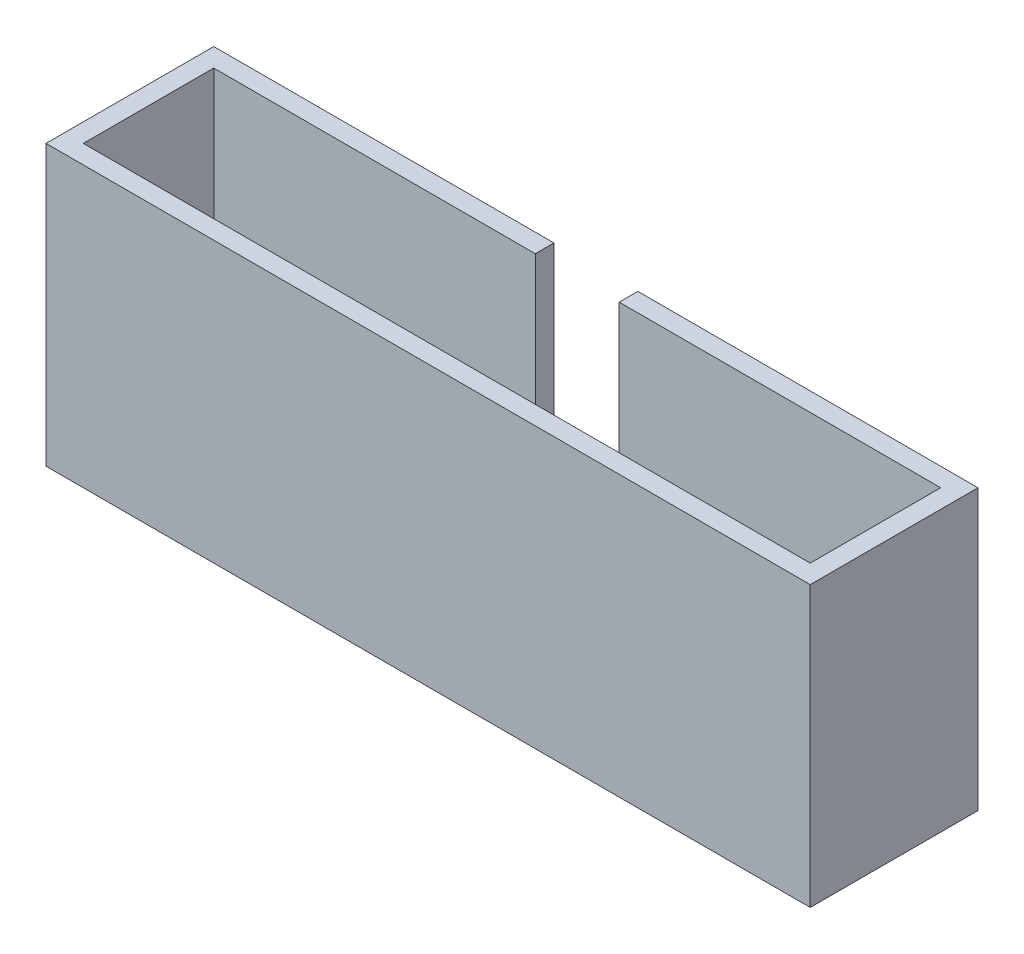
ISO-10303-21;
HEADER;
FILE_DESCRIPTION(('STEP AP214'),'2;1');
FILE_NAME('part.step','',(''),(''),'','','');
FILE_SCHEMA(('AUTOMOTIVE_DESIGN { 1 0 10303 214 1 1 1 1 }'));
ENDSEC;
DATA;
#1=APPLICATION_CONTEXT('core data for automotive mechanical design processes');
#2=APPLICATION_PROTOCOL_DEFINITION('international standard','automotive_design',2000,#1);
#3=PRODUCT_CONTEXT('',#1,'mechanical');
#4=PRODUCT('Part','Part','',(#3));
#5=PRODUCT_RELATED_PRODUCT_CATEGORY('part','',(#4));
#6=PRODUCT_DEFINITION_FORMATION('','',#4);
#7=PRODUCT_DEFINITION_CONTEXT('part definition',#1,'design');
#8=PRODUCT_DEFINITION('design','',#6,#7);
#9=PRODUCT_DEFINITION_SHAPE('','',#8);
#10=(LENGTH_UNIT() NAMED_UNIT(*) SI_UNIT(.MILLI.,.METRE.));
#11=(NAMED_UNIT(*) PLANE_ANGLE_UNIT() SI_UNIT($,.RADIAN.));
#12=(NAMED_UNIT(*) SI_UNIT($,.STERADIAN.) SOLID_ANGLE_UNIT());
#13=UNCERTAINTY_MEASURE_WITH_UNIT(LENGTH_MEASURE(1.E-05),#10,'distance_accuracy_value','');
#14=(GEOMETRIC_REPRESENTATION_CONTEXT(3) GLOBAL_UNCERTAINTY_ASSIGNED_CONTEXT((#13)) GLOBAL_UNIT_ASSIGNED_CONTEXT((#10,
#11,#12)) REPRESENTATION_CONTEXT('',''));
#15=CARTESIAN_POINT('',(0.,0.,0.));
#16=DIRECTION('',(0.,0.,1.));
#17=DIRECTION('',(1.,0.,0.));
#18=AXIS2_PLACEMENT_3D('',#15,#16,#17);
#19=CARTESIAN_POINT('',(19.5,5.,-3.5));
#20=DIRECTION('',(0.,0.,-1.));
#21=DIRECTION('',(-1.,0.,0.));
#22=AXIS2_PLACEMENT_3D('',#19,#20,#21);
#23=PLANE('',#22);
#24=DIRECTION('',(-1.,0.,0.));
#25=VECTOR('',#24,1.);
#26=CARTESIAN_POINT('',(19.5,5.,-3.5));
#27=LINE('',#26,#25);
#28=CARTESIAN_POINT('',(-2.25,5.,-3.5));
#29=VERTEX_POINT('',#28);
#30=CARTESIAN_POINT('',(-19.5,5.,-3.5));
#31=VERTEX_POINT('',#30);
#32=EDGE_CURVE('E230',#29,#31,#27,.T.);
#33=ORIENTED_EDGE('',*,*,#32,.F.);
#34=DIRECTION('',(0.,1.,0.));
#35=VECTOR('',#34,1.);
#36=CARTESIAN_POINT('',(-2.25,5.,-3.5));
#37=LINE('',#36,#35);
#38=CARTESIAN_POINT('',(-2.25,15.,-3.5));
#39=VERTEX_POINT('',#38);
#40=EDGE_CURVE('E218',#29,#39,#37,.T.);
#41=ORIENTED_EDGE('',*,*,#40,.T.);
#42=DIRECTION('',(-1.,0.,0.));
#43=VECTOR('',#42,1.);
#44=CARTESIAN_POINT('',(19.5,15.,-3.5));
#45=LINE('',#44,#43);
#46=CARTESIAN_POINT('',(-19.5,15.,-3.5));
#47=VERTEX_POINT('',#46);
#48=EDGE_CURVE('E153',#39,#47,#45,.T.);
#49=ORIENTED_EDGE('',*,*,#48,.T.);
#50=DIRECTION('',(0.,1.,0.));
#51=VECTOR('',#50,1.);
#52=CARTESIAN_POINT('',(-19.5,5.,-3.5));
#53=LINE('',#52,#51);
#54=EDGE_CURVE('E162',#31,#47,#53,.T.);
#55=ORIENTED_EDGE('',*,*,#54,.F.);
#56=EDGE_LOOP('',(#33,#41,#49,#55));
#57=FACE_BOUND('',#56,.T.);
#58=ADVANCED_FACE('F36',(#57),#23,.F.);
#59=CARTESIAN_POINT('',(0.,15.,4.5));
#60=DIRECTION('',(0.,0.,-1.));
#61=DIRECTION('',(-1.,0.,0.));
#62=AXIS2_PLACEMENT_3D('',#59,#60,#61);
#63=PLANE('',#62);
#64=DIRECTION('',(1.,0.,0.));
#65=VECTOR('',#64,1.);
#66=CARTESIAN_POINT('',(0.,0.,4.5));
#67=LINE('',#66,#65);
#68=CARTESIAN_POINT('',(-20.5,0.,4.5));
#69=VERTEX_POINT('',#68);
#70=CARTESIAN_POINT('',(20.5,0.,4.5));
#71=VERTEX_POINT('',#70);
#72=EDGE_CURVE('E164',#69,#71,#67,.T.);
#73=ORIENTED_EDGE('',*,*,#72,.T.);
#74=DIRECTION('',(0.,-1.,0.));
#75=VECTOR('',#74,1.);
#76=CARTESIAN_POINT('',(20.5,15.,4.5));
#77=LINE('',#76,#75);
#78=CARTESIAN_POINT('',(20.5,15.,4.5));
#79=VERTEX_POINT('',#78);
#80=EDGE_CURVE('E11',#79,#71,#77,.T.);
#81=ORIENTED_EDGE('',*,*,#80,.F.);
#82=DIRECTION('',(1.,0.,0.));
#83=VECTOR('',#82,1.);
#84=CARTESIAN_POINT('',(0.,15.,4.5));
#85=LINE('',#84,#83);
#86=CARTESIAN_POINT('',(-20.5,15.,4.5));
#87=VERTEX_POINT('',#86);
#88=EDGE_CURVE('E171',#87,#79,#85,.T.);
#89=ORIENTED_EDGE('',*,*,#88,.F.);
#90=DIRECTION('',(0.,-1.,0.));
#91=VECTOR('',#90,1.);
#92=CARTESIAN_POINT('',(-20.5,15.,4.5));
#93=LINE('',#92,#91);
#94=EDGE_CURVE('E181',#87,#69,#93,.T.);
#95=ORIENTED_EDGE('',*,*,#94,.T.);
#96=EDGE_LOOP('',(#73,#81,#89,#95));
#97=FACE_BOUND('',#96,.T.);
#98=ADVANCED_FACE('F38',(#97),#63,.F.);
#99=CARTESIAN_POINT('',(20.5,15.,0.));
#100=DIRECTION('',(-1.,0.,0.));
#101=DIRECTION('',(0.,0.,1.));
#102=AXIS2_PLACEMENT_3D('',#99,#100,#101);
#103=PLANE('',#102);
#104=DIRECTION('',(0.,0.,-1.));
#105=VECTOR('',#104,1.);
#106=CARTESIAN_POINT('',(20.5,0.,0.));
#107=LINE('',#106,#105);
#108=CARTESIAN_POINT('',(20.5,0.,-4.5));
#109=VERTEX_POINT('',#108);
#110=EDGE_CURVE('E184',#71,#109,#107,.T.);
#111=ORIENTED_EDGE('',*,*,#110,.T.);
#112=DIRECTION('',(0.,-1.,0.));
#113=VECTOR('',#112,1.);
#114=CARTESIAN_POINT('',(20.5,15.,-4.5));
#115=LINE('',#114,#113);
#116=CARTESIAN_POINT('',(20.5,15.,-4.5));
#117=VERTEX_POINT('',#116);
#118=EDGE_CURVE('E44',#117,#109,#115,.T.);
#119=ORIENTED_EDGE('',*,*,#118,.F.);
#120=DIRECTION('',(0.,0.,-1.));
#121=VECTOR('',#120,1.);
#122=CARTESIAN_POINT('',(20.5,15.,0.));
#123=LINE('',#122,#121);
#124=EDGE_CURVE('E174',#79,#117,#123,.T.);
#125=ORIENTED_EDGE('',*,*,#124,.F.);
#126=ORIENTED_EDGE('',*,*,#80,.T.);
#127=EDGE_LOOP('',(#111,#119,#125,#126));
#128=FACE_BOUND('',#127,.T.);
#129=ADVANCED_FACE('F264',(#128),#103,.F.);
#130=CARTESIAN_POINT('',(0.,15.,-4.5));
#131=DIRECTION('',(0.,0.,1.));
#132=DIRECTION('',(1.,0.,0.));
#133=AXIS2_PLACEMENT_3D('',#130,#131,#132);
#134=PLANE('',#133);
#135=DIRECTION('',(-1.,0.,0.));
#136=VECTOR('',#135,1.);
#137=CARTESIAN_POINT('',(0.,15.,-4.5));
#138=LINE('',#137,#136);
#139=CARTESIAN_POINT('',(-2.25,15.,-4.5));
#140=VERTEX_POINT('',#139);
#141=CARTESIAN_POINT('',(-20.5,15.,-4.5));
#142=VERTEX_POINT('',#141);
#143=EDGE_CURVE('E177',#140,#142,#138,.T.);
#144=ORIENTED_EDGE('',*,*,#143,.F.);
#145=DIRECTION('',(0.,-1.,0.));
#146=VECTOR('',#145,1.);
#147=CARTESIAN_POINT('',(-2.25,15.,-4.5));
#148=LINE('',#147,#146);
#149=CARTESIAN_POINT('',(-2.25,5.,-4.5));
#150=VERTEX_POINT('',#149);
#151=EDGE_CURVE('E215',#140,#150,#148,.T.);
#152=ORIENTED_EDGE('',*,*,#151,.T.);
#153=DIRECTION('',(-1.,0.,0.));
#154=VECTOR('',#153,1.);
#155=CARTESIAN_POINT('',(0.,5.,-4.5));
#156=LINE('',#155,#154);
#157=CARTESIAN_POINT('',(2.25,5.,-4.5));
#158=VERTEX_POINT('',#157);
#159=EDGE_CURVE('E216',#158,#150,#156,.T.);
#160=ORIENTED_EDGE('',*,*,#159,.F.);
#161=DIRECTION('',(0.,1.,0.));
#162=VECTOR('',#161,1.);
#163=CARTESIAN_POINT('',(2.25,15.,-4.5));
#164=LINE('',#163,#162);
#165=CARTESIAN_POINT('',(2.25,15.,-4.5));
#166=VERTEX_POINT('',#165);
#167=EDGE_CURVE('E136',#158,#166,#164,.T.);
#168=ORIENTED_EDGE('',*,*,#167,.T.);
#169=EDGE_CURVE('E146',#117,#166,#138,.T.);
#170=ORIENTED_EDGE('',*,*,#169,.F.);
#171=ORIENTED_EDGE('',*,*,#118,.T.);
#172=DIRECTION('',(-1.,0.,0.));
#173=VECTOR('',#172,1.);
#174=CARTESIAN_POINT('',(0.,0.,-4.5));
#175=LINE('',#174,#173);
#176=CARTESIAN_POINT('',(-20.5,0.,-4.5));
#177=VERTEX_POINT('',#176);
#178=EDGE_CURVE('E186',#109,#177,#175,.T.);
#179=ORIENTED_EDGE('',*,*,#178,.T.);
#180=DIRECTION('',(0.,-1.,0.));
#181=VECTOR('',#180,1.);
#182=CARTESIAN_POINT('',(-20.5,15.,-4.5));
#183=LINE('',#182,#181);
#184=EDGE_CURVE('E191',#142,#177,#183,.T.);
#185=ORIENTED_EDGE('',*,*,#184,.F.);
#186=EDGE_LOOP('',(#144,#152,#160,#168,#170,#171,#179,#185));
#187=FACE_BOUND('',#186,.T.);
#188=ADVANCED_FACE('F198',(#187),#134,.F.);
#189=CARTESIAN_POINT('',(-20.5,15.,0.));
#190=DIRECTION('',(1.,0.,0.));
#191=DIRECTION('',(0.,0.,-1.));
#192=AXIS2_PLACEMENT_3D('',#189,#190,#191);
#193=PLANE('',#192);
#194=DIRECTION('',(0.,0.,1.));
#195=VECTOR('',#194,1.);
#196=CARTESIAN_POINT('',(-20.5,0.,0.));
#197=LINE('',#196,#195);
#198=EDGE_CURVE('E175',#177,#69,#197,.T.);
#199=ORIENTED_EDGE('',*,*,#198,.T.);
#200=ORIENTED_EDGE('',*,*,#94,.F.);
#201=DIRECTION('',(0.,0.,1.));
#202=VECTOR('',#201,1.);
#203=CARTESIAN_POINT('',(-20.5,15.,0.));
#204=LINE('',#203,#202);
#205=EDGE_CURVE('E179',#142,#87,#204,.T.);
#206=ORIENTED_EDGE('',*,*,#205,.F.);
#207=ORIENTED_EDGE('',*,*,#184,.T.);
#208=EDGE_LOOP('',(#199,#200,#206,#207));
#209=FACE_BOUND('',#208,.T.);
#210=ADVANCED_FACE('F207',(#209),#193,.F.);
#211=CARTESIAN_POINT('',(0.,15.,0.));
#212=DIRECTION('',(0.,1.,0.));
#213=DIRECTION('',(0.,0.,1.));
#214=AXIS2_PLACEMENT_3D('',#211,#212,#213);
#215=PLANE('',#214);
#216=DIRECTION('',(0.,0.,1.));
#217=VECTOR('',#216,1.);
#218=CARTESIAN_POINT('',(-2.25,15.,0.));
#219=LINE('',#218,#217);
#220=EDGE_CURVE('E147',#140,#39,#219,.T.);
#221=ORIENTED_EDGE('',*,*,#220,.F.);
#222=ORIENTED_EDGE('',*,*,#143,.T.);
#223=ORIENTED_EDGE('',*,*,#205,.T.);
#224=ORIENTED_EDGE('',*,*,#88,.T.);
#225=ORIENTED_EDGE('',*,*,#124,.T.);
#226=ORIENTED_EDGE('',*,*,#169,.T.);
#227=DIRECTION('',(0.,0.,-1.));
#228=VECTOR('',#227,1.);
#229=CARTESIAN_POINT('',(2.25,15.,0.));
#230=LINE('',#229,#228);
#231=CARTESIAN_POINT('',(2.25,15.,-3.5));
#232=VERTEX_POINT('',#231);
#233=EDGE_CURVE('E128',#232,#166,#230,.T.);
#234=ORIENTED_EDGE('',*,*,#233,.F.);
#235=CARTESIAN_POINT('',(19.5,15.,-3.5));
#236=VERTEX_POINT('',#235);
#237=EDGE_CURVE('E144',#236,#232,#45,.T.);
#238=ORIENTED_EDGE('',*,*,#237,.F.);
#239=DIRECTION('',(0.,0.,-1.));
#240=VECTOR('',#239,1.);
#241=CARTESIAN_POINT('',(19.5,15.,3.5));
#242=LINE('',#241,#240);
#243=CARTESIAN_POINT('',(19.5,15.,3.5));
#244=VERTEX_POINT('',#243);
#245=EDGE_CURVE('E158',#244,#236,#242,.T.);
#246=ORIENTED_EDGE('',*,*,#245,.F.);
#247=DIRECTION('',(1.,0.,0.));
#248=VECTOR('',#247,1.);
#249=CARTESIAN_POINT('',(19.5,15.,3.5));
#250=LINE('',#249,#248);
#251=CARTESIAN_POINT('',(-19.5,15.,3.5));
#252=VERTEX_POINT('',#251);
#253=EDGE_CURVE('E232',#252,#244,#250,.T.);
#254=ORIENTED_EDGE('',*,*,#253,.F.);
#255=DIRECTION('',(0.,0.,1.));
#256=VECTOR('',#255,1.);
#257=CARTESIAN_POINT('',(-19.5,15.,3.5));
#258=LINE('',#257,#256);
#259=EDGE_CURVE('E59',#47,#252,#258,.T.);
#260=ORIENTED_EDGE('',*,*,#259,.F.);
#261=ORIENTED_EDGE('',*,*,#48,.F.);
#262=EDGE_LOOP('',(#221,#222,#223,#224,#225,#226,#234,#238,#246,#254,#260,#261));
#263=FACE_BOUND('',#262,.T.);
#264=ADVANCED_FACE('F142',(#263),#215,.T.);
#265=CARTESIAN_POINT('',(0.,0.,0.));
#266=DIRECTION('',(0.,1.,0.));
#267=DIRECTION('',(0.,0.,1.));
#268=AXIS2_PLACEMENT_3D('',#265,#266,#267);
#269=PLANE('',#268);
#270=ORIENTED_EDGE('',*,*,#72,.F.);
#271=ORIENTED_EDGE('',*,*,#198,.F.);
#272=ORIENTED_EDGE('',*,*,#178,.F.);
#273=ORIENTED_EDGE('',*,*,#110,.F.);
#274=EDGE_LOOP('',(#270,#271,#272,#273));
#275=FACE_BOUND('',#274,.T.);
#276=ADVANCED_FACE('F204',(#275),#269,.F.);
#277=CARTESIAN_POINT('',(-19.5,5.,3.5));
#278=DIRECTION('',(-1.,0.,0.));
#279=DIRECTION('',(0.,0.,1.));
#280=AXIS2_PLACEMENT_3D('',#277,#278,#279);
#281=PLANE('',#280);
#282=ORIENTED_EDGE('',*,*,#259,.T.);
#283=DIRECTION('',(0.,1.,0.));
#284=VECTOR('',#283,1.);
#285=CARTESIAN_POINT('',(-19.5,5.,3.5));
#286=LINE('',#285,#284);
#287=CARTESIAN_POINT('',(-19.5,5.,3.5));
#288=VERTEX_POINT('',#287);
#289=EDGE_CURVE('E168',#288,#252,#286,.T.);
#290=ORIENTED_EDGE('',*,*,#289,.F.);
#291=DIRECTION('',(0.,0.,1.));
#292=VECTOR('',#291,1.);
#293=CARTESIAN_POINT('',(-19.5,5.,3.5));
#294=LINE('',#293,#292);
#295=EDGE_CURVE('E152',#31,#288,#294,.T.);
#296=ORIENTED_EDGE('',*,*,#295,.F.);
#297=ORIENTED_EDGE('',*,*,#54,.T.);
#298=EDGE_LOOP('',(#282,#290,#296,#297));
#299=FACE_BOUND('',#298,.T.);
#300=ADVANCED_FACE('F243',(#299),#281,.F.);
#301=ORIENTED_EDGE('',*,*,#237,.T.);
#302=DIRECTION('',(0.,-1.,0.));
#303=VECTOR('',#302,1.);
#304=CARTESIAN_POINT('',(2.25,5.,-3.5));
#305=LINE('',#304,#303);
#306=CARTESIAN_POINT('',(2.25,5.,-3.5));
#307=VERTEX_POINT('',#306);
#308=EDGE_CURVE('E125',#232,#307,#305,.T.);
#309=ORIENTED_EDGE('',*,*,#308,.T.);
#310=CARTESIAN_POINT('',(19.5,5.,-3.5));
#311=VERTEX_POINT('',#310);
#312=EDGE_CURVE('E170',#311,#307,#27,.T.);
#313=ORIENTED_EDGE('',*,*,#312,.F.);
#314=DIRECTION('',(0.,1.,0.));
#315=VECTOR('',#314,1.);
#316=CARTESIAN_POINT('',(19.5,5.,-3.5));
#317=LINE('',#316,#315);
#318=EDGE_CURVE('E150',#311,#236,#317,.T.);
#319=ORIENTED_EDGE('',*,*,#318,.T.);
#320=EDGE_LOOP('',(#301,#309,#313,#319));
#321=FACE_BOUND('',#320,.T.);
#322=ADVANCED_FACE('F149',(#321),#23,.F.);
#323=CARTESIAN_POINT('',(19.5,5.,3.5));
#324=DIRECTION('',(1.,0.,0.));
#325=DIRECTION('',(0.,0.,-1.));
#326=AXIS2_PLACEMENT_3D('',#323,#324,#325);
#327=PLANE('',#326);
#328=ORIENTED_EDGE('',*,*,#245,.T.);
#329=ORIENTED_EDGE('',*,*,#318,.F.);
#330=DIRECTION('',(0.,0.,-1.));
#331=VECTOR('',#330,1.);
#332=CARTESIAN_POINT('',(19.5,5.,3.5));
#333=LINE('',#332,#331);
#334=CARTESIAN_POINT('',(19.5,5.,3.5));
#335=VERTEX_POINT('',#334);
#336=EDGE_CURVE('E227',#335,#311,#333,.T.);
#337=ORIENTED_EDGE('',*,*,#336,.F.);
#338=DIRECTION('',(0.,1.,0.));
#339=VECTOR('',#338,1.);
#340=CARTESIAN_POINT('',(19.5,5.,3.5));
#341=LINE('',#340,#339);
#342=EDGE_CURVE('E166',#335,#244,#341,.T.);
#343=ORIENTED_EDGE('',*,*,#342,.T.);
#344=EDGE_LOOP('',(#328,#329,#337,#343));
#345=FACE_BOUND('',#344,.T.);
#346=ADVANCED_FACE('F237',(#345),#327,.F.);
#347=CARTESIAN_POINT('',(19.5,5.,3.5));
#348=DIRECTION('',(0.,0.,1.));
#349=DIRECTION('',(1.,0.,0.));
#350=AXIS2_PLACEMENT_3D('',#347,#348,#349);
#351=PLANE('',#350);
#352=ORIENTED_EDGE('',*,*,#253,.T.);
#353=ORIENTED_EDGE('',*,*,#342,.F.);
#354=DIRECTION('',(1.,0.,0.));
#355=VECTOR('',#354,1.);
#356=CARTESIAN_POINT('',(19.5,5.,3.5));
#357=LINE('',#356,#355);
#358=EDGE_CURVE('E156',#288,#335,#357,.T.);
#359=ORIENTED_EDGE('',*,*,#358,.F.);
#360=ORIENTED_EDGE('',*,*,#289,.T.);
#361=EDGE_LOOP('',(#352,#353,#359,#360));
#362=FACE_BOUND('',#361,.T.);
#363=ADVANCED_FACE('F246',(#362),#351,.F.);
#364=CARTESIAN_POINT('',(0.,5.,0.));
#365=DIRECTION('',(0.,1.,0.));
#366=DIRECTION('',(0.,0.,1.));
#367=AXIS2_PLACEMENT_3D('',#364,#365,#366);
#368=PLANE('',#367);
#369=ORIENTED_EDGE('',*,*,#312,.T.);
#370=DIRECTION('',(0.,0.,-1.));
#371=VECTOR('',#370,1.);
#372=CARTESIAN_POINT('',(2.25,5.,0.));
#373=LINE('',#372,#371);
#374=EDGE_CURVE('E131',#307,#158,#373,.T.);
#375=ORIENTED_EDGE('',*,*,#374,.T.);
#376=ORIENTED_EDGE('',*,*,#159,.T.);
#377=DIRECTION('',(0.,0.,1.));
#378=VECTOR('',#377,1.);
#379=CARTESIAN_POINT('',(-2.25,5.,0.));
#380=LINE('',#379,#378);
#381=EDGE_CURVE('E51',#150,#29,#380,.T.);
#382=ORIENTED_EDGE('',*,*,#381,.T.);
#383=ORIENTED_EDGE('',*,*,#32,.T.);
#384=ORIENTED_EDGE('',*,*,#295,.T.);
#385=ORIENTED_EDGE('',*,*,#358,.T.);
#386=ORIENTED_EDGE('',*,*,#336,.T.);
#387=EDGE_LOOP('',(#369,#375,#376,#382,#383,#384,#385,#386));
#388=FACE_BOUND('',#387,.T.);
#389=ADVANCED_FACE('F245',(#388),#368,.T.);
#390=CARTESIAN_POINT('',(-2.25,5.,0.));
#391=DIRECTION('',(-1.,0.,0.));
#392=DIRECTION('',(0.,0.,1.));
#393=AXIS2_PLACEMENT_3D('',#390,#391,#392);
#394=PLANE('',#393);
#395=ORIENTED_EDGE('',*,*,#220,.T.);
#396=ORIENTED_EDGE('',*,*,#40,.F.);
#397=ORIENTED_EDGE('',*,*,#381,.F.);
#398=ORIENTED_EDGE('',*,*,#151,.F.);
#399=EDGE_LOOP('',(#395,#396,#397,#398));
#400=FACE_BOUND('',#399,.T.);
#401=ADVANCED_FACE('F254',(#400),#394,.F.);
#402=CARTESIAN_POINT('',(2.25,5.,0.));
#403=DIRECTION('',(1.,0.,0.));
#404=DIRECTION('',(0.,0.,-1.));
#405=AXIS2_PLACEMENT_3D('',#402,#403,#404);
#406=PLANE('',#405);
#407=ORIENTED_EDGE('',*,*,#374,.F.);
#408=ORIENTED_EDGE('',*,*,#308,.F.);
#409=ORIENTED_EDGE('',*,*,#233,.T.);
#410=ORIENTED_EDGE('',*,*,#167,.F.);
#411=EDGE_LOOP('',(#407,#408,#409,#410));
#412=FACE_BOUND('',#411,.T.);
#413=ADVANCED_FACE('F127',(#412),#406,.F.);
#414=CLOSED_SHELL('',(#58,#98,#129,#188,#210,#264,#276,#300,#322,#346,#363,#389,#401,#413));
#415=MANIFOLD_SOLID_BREP('B2',#414);
#416=ADVANCED_BREP_SHAPE_REPRESENTATION('',(#18,#415),#14);
#417=SHAPE_DEFINITION_REPRESENTATION(#9,#416);
ENDSEC;
END-ISO-10303-21;
